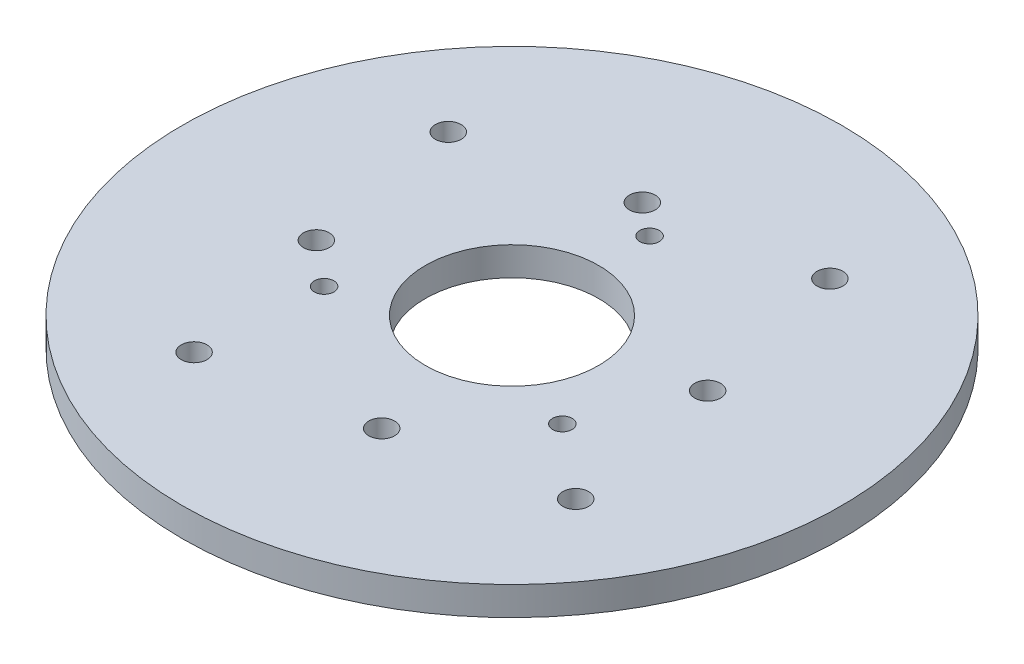
ISO-10303-21;
HEADER;
FILE_DESCRIPTION(('STEP AP214'),'2;1');
FILE_NAME('part.step','',(''),(''),'','','');
FILE_SCHEMA(('AUTOMOTIVE_DESIGN { 1 0 10303 214 1 1 1 1 }'));
ENDSEC;
DATA;
#1=APPLICATION_CONTEXT('core data for automotive mechanical design processes');
#2=APPLICATION_PROTOCOL_DEFINITION('international standard','automotive_design',2000,#1);
#3=PRODUCT_CONTEXT('',#1,'mechanical');
#4=PRODUCT('Part','Part','',(#3));
#5=PRODUCT_RELATED_PRODUCT_CATEGORY('part','',(#4));
#6=PRODUCT_DEFINITION_FORMATION('','',#4);
#7=PRODUCT_DEFINITION_CONTEXT('part definition',#1,'design');
#8=PRODUCT_DEFINITION('design','',#6,#7);
#9=PRODUCT_DEFINITION_SHAPE('','',#8);
#10=(LENGTH_UNIT() NAMED_UNIT(*) SI_UNIT(.MILLI.,.METRE.));
#11=(NAMED_UNIT(*) PLANE_ANGLE_UNIT() SI_UNIT($,.RADIAN.));
#12=(NAMED_UNIT(*) SI_UNIT($,.STERADIAN.) SOLID_ANGLE_UNIT());
#13=UNCERTAINTY_MEASURE_WITH_UNIT(LENGTH_MEASURE(1.E-05),#10,'distance_accuracy_value','');
#14=(GEOMETRIC_REPRESENTATION_CONTEXT(3) GLOBAL_UNCERTAINTY_ASSIGNED_CONTEXT((#13)) GLOBAL_UNIT_ASSIGNED_CONTEXT((#10,
#11,#12)) REPRESENTATION_CONTEXT('',''));
#15=CARTESIAN_POINT('',(0.,0.,0.));
#16=DIRECTION('',(0.,0.,1.));
#17=DIRECTION('',(1.,0.,0.));
#18=AXIS2_PLACEMENT_3D('',#15,#16,#17);
#19=CARTESIAN_POINT('',(0.,5.,0.));
#20=DIRECTION('',(0.,1.,0.));
#21=DIRECTION('',(0.,0.,1.));
#22=AXIS2_PLACEMENT_3D('',#19,#20,#21);
#23=PLANE('',#22);
#24=CARTESIAN_POINT('',(0.,5.,-24.));
#25=DIRECTION('',(0.,1.,0.));
#26=DIRECTION('',(0.,0.,1.));
#27=AXIS2_PLACEMENT_3D('',#24,#25,#26);
#28=CIRCLE('',#27,1.7);
#29=CARTESIAN_POINT('',(0.,5.,-22.3));
#30=VERTEX_POINT('',#29);
#31=EDGE_CURVE('E120',#30,#30,#28,.T.);
#32=ORIENTED_EDGE('',*,*,#31,.F.);
#33=EDGE_LOOP('',(#32));
#34=FACE_BOUND('',#33,.T.);
#35=CARTESIAN_POINT('',(20.7846096908265,5.,12.0000000000001));
#36=DIRECTION('',(0.,1.,0.));
#37=DIRECTION('',(0.,0.,1.));
#38=AXIS2_PLACEMENT_3D('',#35,#36,#37);
#39=CIRCLE('',#38,1.7);
#40=CARTESIAN_POINT('',(20.7846096908265,5.,13.7000000000001));
#41=VERTEX_POINT('',#40);
#42=EDGE_CURVE('E117',#41,#41,#39,.T.);
#43=ORIENTED_EDGE('',*,*,#42,.F.);
#44=EDGE_LOOP('',(#43));
#45=FACE_BOUND('',#44,.T.);
#46=CARTESIAN_POINT('',(-20.7846096908266,5.,11.9999999999998));
#47=DIRECTION('',(0.,1.,0.));
#48=DIRECTION('',(0.,0.,1.));
#49=AXIS2_PLACEMENT_3D('',#46,#47,#48);
#50=CIRCLE('',#49,1.7);
#51=CARTESIAN_POINT('',(-20.7846096908266,5.,13.6999999999998));
#52=VERTEX_POINT('',#51);
#53=EDGE_CURVE('E111',#52,#52,#50,.T.);
#54=ORIENTED_EDGE('',*,*,#53,.F.);
#55=EDGE_LOOP('',(#54));
#56=FACE_BOUND('',#55,.T.);
#57=CARTESIAN_POINT('',(28.4344418205609,5.,-5.69934367740181));
#58=DIRECTION('',(0.,1.,0.));
#59=DIRECTION('',(0.,0.,1.));
#60=AXIS2_PLACEMENT_3D('',#57,#58,#59);
#61=CIRCLE('',#60,2.25000000000002);
#62=CARTESIAN_POINT('',(28.4344418205609,5.,-3.44934367740179));
#63=VERTEX_POINT('',#62);
#64=EDGE_CURVE('E93',#63,#63,#61,.T.);
#65=ORIENTED_EDGE('',*,*,#64,.F.);
#66=EDGE_LOOP('',(#65));
#67=FACE_BOUND('',#66,.T.);
#68=CARTESIAN_POINT('',(-5.69934367740181,5.,-28.4344418205609));
#69=DIRECTION('',(0.,1.,0.));
#70=DIRECTION('',(0.,0.,1.));
#71=AXIS2_PLACEMENT_3D('',#68,#69,#70);
#72=CIRCLE('',#71,2.25000000000004);
#73=CARTESIAN_POINT('',(-5.69934367740181,5.,-26.1844418205608));
#74=VERTEX_POINT('',#73);
#75=EDGE_CURVE('E81',#74,#74,#72,.T.);
#76=ORIENTED_EDGE('',*,*,#75,.F.);
#77=EDGE_LOOP('',(#76));
#78=FACE_BOUND('',#77,.T.);
#79=CARTESIAN_POINT('',(-28.4344418205609,5.,5.69934367740181));
#80=DIRECTION('',(0.,1.,0.));
#81=DIRECTION('',(0.,0.,1.));
#82=AXIS2_PLACEMENT_3D('',#79,#80,#81);
#83=CIRCLE('',#82,2.25000000000002);
#84=CARTESIAN_POINT('',(-28.4344418205609,5.,7.94934367740183));
#85=VERTEX_POINT('',#84);
#86=EDGE_CURVE('E69',#85,#85,#83,.T.);
#87=ORIENTED_EDGE('',*,*,#86,.F.);
#88=EDGE_LOOP('',(#87));
#89=FACE_BOUND('',#88,.T.);
#90=CARTESIAN_POINT('',(5.69934367740181,5.,28.4344418205609));
#91=DIRECTION('',(0.,1.,0.));
#92=DIRECTION('',(0.,0.,1.));
#93=AXIS2_PLACEMENT_3D('',#90,#91,#92);
#94=CIRCLE('',#93,2.25000000000004);
#95=CARTESIAN_POINT('',(5.69934367740181,5.,30.6844418205609));
#96=VERTEX_POINT('',#95);
#97=EDGE_CURVE('E57',#96,#96,#94,.T.);
#98=ORIENTED_EDGE('',*,*,#97,.F.);
#99=EDGE_LOOP('',(#98));
#100=FACE_BOUND('',#99,.T.);
#101=CARTESIAN_POINT('',(0.,5.,0.));
#102=DIRECTION('',(0.,1.,0.));
#103=DIRECTION('',(0.,0.,1.));
#104=AXIS2_PLACEMENT_3D('',#101,#102,#103);
#105=CIRCLE('',#104,57.5);
#106=CARTESIAN_POINT('',(0.,5.,57.5));
#107=VERTEX_POINT('',#106);
#108=EDGE_CURVE('E10',#107,#107,#105,.T.);
#109=ORIENTED_EDGE('',*,*,#108,.T.);
#110=EDGE_LOOP('',(#109));
#111=FACE_BOUND('',#110,.T.);
#112=CARTESIAN_POINT('',(0.,5.,0.));
#113=DIRECTION('',(0.,1.,0.));
#114=DIRECTION('',(0.,0.,1.));
#115=AXIS2_PLACEMENT_3D('',#112,#113,#114);
#116=CIRCLE('',#115,15.125);
#117=CARTESIAN_POINT('',(0.,5.,15.125));
#118=VERTEX_POINT('',#117);
#119=EDGE_CURVE('E52',#118,#118,#116,.T.);
#120=ORIENTED_EDGE('',*,*,#119,.F.);
#121=EDGE_LOOP('',(#120));
#122=FACE_BOUND('',#121,.T.);
#123=CARTESIAN_POINT('',(33.2913533698986,5.,22.1739890592681));
#124=DIRECTION('',(0.,1.,0.));
#125=DIRECTION('',(0.,0.,1.));
#126=AXIS2_PLACEMENT_3D('',#123,#124,#125);
#127=CIRCLE('',#126,2.25000000000008);
#128=CARTESIAN_POINT('',(33.2913533698986,5.,24.4239890592682));
#129=VERTEX_POINT('',#128);
#130=EDGE_CURVE('E63',#129,#129,#127,.T.);
#131=ORIENTED_EDGE('',*,*,#130,.F.);
#132=EDGE_LOOP('',(#131));
#133=FACE_BOUND('',#132,.T.);
#134=CARTESIAN_POINT('',(-22.1739890592681,5.,33.2913533698986));
#135=DIRECTION('',(0.,1.,0.));
#136=DIRECTION('',(0.,0.,1.));
#137=AXIS2_PLACEMENT_3D('',#134,#135,#136);
#138=CIRCLE('',#137,2.25000000000004);
#139=CARTESIAN_POINT('',(-22.1739890592681,5.,35.5413533698986));
#140=VERTEX_POINT('',#139);
#141=EDGE_CURVE('E75',#140,#140,#138,.T.);
#142=ORIENTED_EDGE('',*,*,#141,.F.);
#143=EDGE_LOOP('',(#142));
#144=FACE_BOUND('',#143,.T.);
#145=CARTESIAN_POINT('',(-33.2913533698986,5.,-22.1739890592681));
#146=DIRECTION('',(0.,1.,0.));
#147=DIRECTION('',(0.,0.,1.));
#148=AXIS2_PLACEMENT_3D('',#145,#146,#147);
#149=CIRCLE('',#148,2.25000000000004);
#150=CARTESIAN_POINT('',(-33.2913533698986,5.,-19.9239890592681));
#151=VERTEX_POINT('',#150);
#152=EDGE_CURVE('E87',#151,#151,#149,.T.);
#153=ORIENTED_EDGE('',*,*,#152,.F.);
#154=EDGE_LOOP('',(#153));
#155=FACE_BOUND('',#154,.T.);
#156=CARTESIAN_POINT('',(22.1739890592681,5.,-33.2913533698986));
#157=DIRECTION('',(0.,1.,0.));
#158=DIRECTION('',(0.,0.,1.));
#159=AXIS2_PLACEMENT_3D('',#156,#157,#158);
#160=CIRCLE('',#159,2.25000000000002);
#161=CARTESIAN_POINT('',(22.1739890592681,5.,-31.0413533698985));
#162=VERTEX_POINT('',#161);
#163=EDGE_CURVE('E99',#162,#162,#160,.T.);
#164=ORIENTED_EDGE('',*,*,#163,.F.);
#165=EDGE_LOOP('',(#164));
#166=FACE_BOUND('',#165,.T.);
#167=ADVANCED_FACE('F41',(#34,#45,#56,#67,#78,#89,#100,#111,#122,#133,#144,#155,#166),#23,.T.);
#168=CARTESIAN_POINT('',(0.,0.,0.));
#169=DIRECTION('',(0.,1.,0.));
#170=DIRECTION('',(0.,0.,1.));
#171=AXIS2_PLACEMENT_3D('',#168,#169,#170);
#172=PLANE('',#171);
#173=CARTESIAN_POINT('',(0.,0.,-24.));
#174=DIRECTION('',(0.,1.,0.));
#175=DIRECTION('',(0.,0.,1.));
#176=AXIS2_PLACEMENT_3D('',#173,#174,#175);
#177=CIRCLE('',#176,1.7);
#178=CARTESIAN_POINT('',(0.,0.,-22.3));
#179=VERTEX_POINT('',#178);
#180=EDGE_CURVE('E105',#179,#179,#177,.T.);
#181=ORIENTED_EDGE('',*,*,#180,.T.);
#182=EDGE_LOOP('',(#181));
#183=FACE_BOUND('',#182,.T.);
#184=CARTESIAN_POINT('',(20.7846096908265,0.,12.0000000000001));
#185=DIRECTION('',(0.,1.,0.));
#186=DIRECTION('',(0.,0.,1.));
#187=AXIS2_PLACEMENT_3D('',#184,#185,#186);
#188=CIRCLE('',#187,1.7);
#189=CARTESIAN_POINT('',(20.7846096908265,0.,13.7000000000001));
#190=VERTEX_POINT('',#189);
#191=EDGE_CURVE('E114',#190,#190,#188,.T.);
#192=ORIENTED_EDGE('',*,*,#191,.T.);
#193=EDGE_LOOP('',(#192));
#194=FACE_BOUND('',#193,.T.);
#195=CARTESIAN_POINT('',(-20.7846096908266,0.,11.9999999999998));
#196=DIRECTION('',(0.,1.,0.));
#197=DIRECTION('',(0.,0.,1.));
#198=AXIS2_PLACEMENT_3D('',#195,#196,#197);
#199=CIRCLE('',#198,1.7);
#200=CARTESIAN_POINT('',(-20.7846096908266,0.,13.6999999999998));
#201=VERTEX_POINT('',#200);
#202=EDGE_CURVE('E108',#201,#201,#199,.T.);
#203=ORIENTED_EDGE('',*,*,#202,.T.);
#204=EDGE_LOOP('',(#203));
#205=FACE_BOUND('',#204,.T.);
#206=CARTESIAN_POINT('',(0.,0.,0.));
#207=DIRECTION('',(0.,1.,0.));
#208=DIRECTION('',(0.,0.,1.));
#209=AXIS2_PLACEMENT_3D('',#206,#207,#208);
#210=CIRCLE('',#209,57.5);
#211=CARTESIAN_POINT('',(0.,0.,57.5));
#212=VERTEX_POINT('',#211);
#213=EDGE_CURVE('E45',#212,#212,#210,.T.);
#214=ORIENTED_EDGE('',*,*,#213,.F.);
#215=EDGE_LOOP('',(#214));
#216=FACE_BOUND('',#215,.T.);
#217=CARTESIAN_POINT('',(0.,0.,0.));
#218=DIRECTION('',(0.,1.,0.));
#219=DIRECTION('',(0.,0.,1.));
#220=AXIS2_PLACEMENT_3D('',#217,#218,#219);
#221=CIRCLE('',#220,15.125);
#222=CARTESIAN_POINT('',(0.,0.,15.125));
#223=VERTEX_POINT('',#222);
#224=EDGE_CURVE('E54',#223,#223,#221,.T.);
#225=ORIENTED_EDGE('',*,*,#224,.T.);
#226=EDGE_LOOP('',(#225));
#227=FACE_BOUND('',#226,.T.);
#228=CARTESIAN_POINT('',(5.69934367740181,0.,28.4344418205609));
#229=DIRECTION('',(0.,1.,0.));
#230=DIRECTION('',(0.,0.,1.));
#231=AXIS2_PLACEMENT_3D('',#228,#229,#230);
#232=CIRCLE('',#231,2.25000000000004);
#233=CARTESIAN_POINT('',(5.69934367740181,0.,30.6844418205609));
#234=VERTEX_POINT('',#233);
#235=EDGE_CURVE('E60',#234,#234,#232,.T.);
#236=ORIENTED_EDGE('',*,*,#235,.T.);
#237=EDGE_LOOP('',(#236));
#238=FACE_BOUND('',#237,.T.);
#239=CARTESIAN_POINT('',(33.2913533698986,0.,22.1739890592681));
#240=DIRECTION('',(0.,1.,0.));
#241=DIRECTION('',(0.,0.,1.));
#242=AXIS2_PLACEMENT_3D('',#239,#240,#241);
#243=CIRCLE('',#242,2.25000000000008);
#244=CARTESIAN_POINT('',(33.2913533698986,0.,24.4239890592682));
#245=VERTEX_POINT('',#244);
#246=EDGE_CURVE('E66',#245,#245,#243,.T.);
#247=ORIENTED_EDGE('',*,*,#246,.T.);
#248=EDGE_LOOP('',(#247));
#249=FACE_BOUND('',#248,.T.);
#250=CARTESIAN_POINT('',(-28.4344418205609,0.,5.69934367740181));
#251=DIRECTION('',(0.,1.,0.));
#252=DIRECTION('',(0.,0.,1.));
#253=AXIS2_PLACEMENT_3D('',#250,#251,#252);
#254=CIRCLE('',#253,2.25000000000002);
#255=CARTESIAN_POINT('',(-28.4344418205609,0.,7.94934367740183));
#256=VERTEX_POINT('',#255);
#257=EDGE_CURVE('E72',#256,#256,#254,.T.);
#258=ORIENTED_EDGE('',*,*,#257,.T.);
#259=EDGE_LOOP('',(#258));
#260=FACE_BOUND('',#259,.T.);
#261=CARTESIAN_POINT('',(-22.1739890592681,0.,33.2913533698986));
#262=DIRECTION('',(0.,1.,0.));
#263=DIRECTION('',(0.,0.,1.));
#264=AXIS2_PLACEMENT_3D('',#261,#262,#263);
#265=CIRCLE('',#264,2.25000000000004);
#266=CARTESIAN_POINT('',(-22.1739890592681,0.,35.5413533698986));
#267=VERTEX_POINT('',#266);
#268=EDGE_CURVE('E78',#267,#267,#265,.T.);
#269=ORIENTED_EDGE('',*,*,#268,.T.);
#270=EDGE_LOOP('',(#269));
#271=FACE_BOUND('',#270,.T.);
#272=CARTESIAN_POINT('',(-5.69934367740181,0.,-28.4344418205609));
#273=DIRECTION('',(0.,1.,0.));
#274=DIRECTION('',(0.,0.,1.));
#275=AXIS2_PLACEMENT_3D('',#272,#273,#274);
#276=CIRCLE('',#275,2.25000000000004);
#277=CARTESIAN_POINT('',(-5.69934367740181,0.,-26.1844418205608));
#278=VERTEX_POINT('',#277);
#279=EDGE_CURVE('E84',#278,#278,#276,.T.);
#280=ORIENTED_EDGE('',*,*,#279,.T.);
#281=EDGE_LOOP('',(#280));
#282=FACE_BOUND('',#281,.T.);
#283=CARTESIAN_POINT('',(-33.2913533698986,0.,-22.1739890592681));
#284=DIRECTION('',(0.,1.,0.));
#285=DIRECTION('',(0.,0.,1.));
#286=AXIS2_PLACEMENT_3D('',#283,#284,#285);
#287=CIRCLE('',#286,2.25000000000004);
#288=CARTESIAN_POINT('',(-33.2913533698986,0.,-19.9239890592681));
#289=VERTEX_POINT('',#288);
#290=EDGE_CURVE('E90',#289,#289,#287,.T.);
#291=ORIENTED_EDGE('',*,*,#290,.T.);
#292=EDGE_LOOP('',(#291));
#293=FACE_BOUND('',#292,.T.);
#294=CARTESIAN_POINT('',(28.4344418205609,0.,-5.69934367740181));
#295=DIRECTION('',(0.,1.,0.));
#296=DIRECTION('',(0.,0.,1.));
#297=AXIS2_PLACEMENT_3D('',#294,#295,#296);
#298=CIRCLE('',#297,2.25000000000002);
#299=CARTESIAN_POINT('',(28.4344418205609,0.,-3.44934367740179));
#300=VERTEX_POINT('',#299);
#301=EDGE_CURVE('E96',#300,#300,#298,.T.);
#302=ORIENTED_EDGE('',*,*,#301,.T.);
#303=EDGE_LOOP('',(#302));
#304=FACE_BOUND('',#303,.T.);
#305=CARTESIAN_POINT('',(22.1739890592681,0.,-33.2913533698986));
#306=DIRECTION('',(0.,1.,0.));
#307=DIRECTION('',(0.,0.,1.));
#308=AXIS2_PLACEMENT_3D('',#305,#306,#307);
#309=CIRCLE('',#308,2.25000000000002);
#310=CARTESIAN_POINT('',(22.1739890592681,0.,-31.0413533698985));
#311=VERTEX_POINT('',#310);
#312=EDGE_CURVE('E102',#311,#311,#309,.T.);
#313=ORIENTED_EDGE('',*,*,#312,.T.);
#314=EDGE_LOOP('',(#313));
#315=FACE_BOUND('',#314,.T.);
#316=ADVANCED_FACE('F126',(#183,#194,#205,#216,#227,#238,#249,#260,#271,#282,#293,#304,#315),
#172,.F.);
#317=CARTESIAN_POINT('',(0.,5.,0.));
#318=DIRECTION('',(0.,-1.,0.));
#319=DIRECTION('',(0.,0.,-1.));
#320=AXIS2_PLACEMENT_3D('',#317,#318,#319);
#321=CYLINDRICAL_SURFACE('',#320,57.5);
#322=ORIENTED_EDGE('',*,*,#108,.F.);
#323=EDGE_LOOP('',(#322));
#324=FACE_BOUND('',#323,.T.);
#325=ORIENTED_EDGE('',*,*,#213,.T.);
#326=EDGE_LOOP('',(#325));
#327=FACE_BOUND('',#326,.T.);
#328=ADVANCED_FACE('F43',(#324,#327),#321,.T.);
#329=CARTESIAN_POINT('',(0.,5.,0.));
#330=DIRECTION('',(0.,-1.,0.));
#331=DIRECTION('',(0.,0.,-1.));
#332=AXIS2_PLACEMENT_3D('',#329,#330,#331);
#333=CYLINDRICAL_SURFACE('',#332,15.125);
#334=ORIENTED_EDGE('',*,*,#119,.T.);
#335=EDGE_LOOP('',(#334));
#336=FACE_BOUND('',#335,.T.);
#337=ORIENTED_EDGE('',*,*,#224,.F.);
#338=EDGE_LOOP('',(#337));
#339=FACE_BOUND('',#338,.T.);
#340=ADVANCED_FACE('F174',(#336,#339),#333,.F.);
#341=CARTESIAN_POINT('',(5.69934367740181,5.,28.4344418205609));
#342=DIRECTION('',(0.,-1.,0.));
#343=DIRECTION('',(0.,0.,-1.));
#344=AXIS2_PLACEMENT_3D('',#341,#342,#343);
#345=CYLINDRICAL_SURFACE('',#344,2.25000000000004);
#346=ORIENTED_EDGE('',*,*,#97,.T.);
#347=EDGE_LOOP('',(#346));
#348=FACE_BOUND('',#347,.T.);
#349=ORIENTED_EDGE('',*,*,#235,.F.);
#350=EDGE_LOOP('',(#349));
#351=FACE_BOUND('',#350,.T.);
#352=ADVANCED_FACE('F179',(#348,#351),#345,.F.);
#353=CARTESIAN_POINT('',(33.2913533698986,5.,22.1739890592681));
#354=DIRECTION('',(0.,-1.,0.));
#355=DIRECTION('',(0.,0.,-1.));
#356=AXIS2_PLACEMENT_3D('',#353,#354,#355);
#357=CYLINDRICAL_SURFACE('',#356,2.25000000000008);
#358=ORIENTED_EDGE('',*,*,#130,.T.);
#359=EDGE_LOOP('',(#358));
#360=FACE_BOUND('',#359,.T.);
#361=ORIENTED_EDGE('',*,*,#246,.F.);
#362=EDGE_LOOP('',(#361));
#363=FACE_BOUND('',#362,.T.);
#364=ADVANCED_FACE('F183',(#360,#363),#357,.F.);
#365=CARTESIAN_POINT('',(-28.4344418205609,5.,5.69934367740181));
#366=DIRECTION('',(0.,-1.,0.));
#367=DIRECTION('',(0.,0.,-1.));
#368=AXIS2_PLACEMENT_3D('',#365,#366,#367);
#369=CYLINDRICAL_SURFACE('',#368,2.25000000000002);
#370=ORIENTED_EDGE('',*,*,#86,.T.);
#371=EDGE_LOOP('',(#370));
#372=FACE_BOUND('',#371,.T.);
#373=ORIENTED_EDGE('',*,*,#257,.F.);
#374=EDGE_LOOP('',(#373));
#375=FACE_BOUND('',#374,.T.);
#376=ADVANCED_FACE('F187',(#372,#375),#369,.F.);
#377=CARTESIAN_POINT('',(-22.1739890592681,5.,33.2913533698986));
#378=DIRECTION('',(0.,-1.,0.));
#379=DIRECTION('',(0.,0.,-1.));
#380=AXIS2_PLACEMENT_3D('',#377,#378,#379);
#381=CYLINDRICAL_SURFACE('',#380,2.25000000000004);
#382=ORIENTED_EDGE('',*,*,#141,.T.);
#383=EDGE_LOOP('',(#382));
#384=FACE_BOUND('',#383,.T.);
#385=ORIENTED_EDGE('',*,*,#268,.F.);
#386=EDGE_LOOP('',(#385));
#387=FACE_BOUND('',#386,.T.);
#388=ADVANCED_FACE('F191',(#384,#387),#381,.F.);
#389=CARTESIAN_POINT('',(-5.69934367740181,5.,-28.4344418205609));
#390=DIRECTION('',(0.,-1.,0.));
#391=DIRECTION('',(0.,0.,-1.));
#392=AXIS2_PLACEMENT_3D('',#389,#390,#391);
#393=CYLINDRICAL_SURFACE('',#392,2.25000000000004);
#394=ORIENTED_EDGE('',*,*,#75,.T.);
#395=EDGE_LOOP('',(#394));
#396=FACE_BOUND('',#395,.T.);
#397=ORIENTED_EDGE('',*,*,#279,.F.);
#398=EDGE_LOOP('',(#397));
#399=FACE_BOUND('',#398,.T.);
#400=ADVANCED_FACE('F195',(#396,#399),#393,.F.);
#401=CARTESIAN_POINT('',(-33.2913533698986,5.,-22.1739890592681));
#402=DIRECTION('',(0.,-1.,0.));
#403=DIRECTION('',(0.,0.,-1.));
#404=AXIS2_PLACEMENT_3D('',#401,#402,#403);
#405=CYLINDRICAL_SURFACE('',#404,2.25000000000004);
#406=ORIENTED_EDGE('',*,*,#152,.T.);
#407=EDGE_LOOP('',(#406));
#408=FACE_BOUND('',#407,.T.);
#409=ORIENTED_EDGE('',*,*,#290,.F.);
#410=EDGE_LOOP('',(#409));
#411=FACE_BOUND('',#410,.T.);
#412=ADVANCED_FACE('F199',(#408,#411),#405,.F.);
#413=CARTESIAN_POINT('',(28.4344418205609,5.,-5.69934367740181));
#414=DIRECTION('',(0.,-1.,0.));
#415=DIRECTION('',(0.,0.,-1.));
#416=AXIS2_PLACEMENT_3D('',#413,#414,#415);
#417=CYLINDRICAL_SURFACE('',#416,2.25000000000002);
#418=ORIENTED_EDGE('',*,*,#64,.T.);
#419=EDGE_LOOP('',(#418));
#420=FACE_BOUND('',#419,.T.);
#421=ORIENTED_EDGE('',*,*,#301,.F.);
#422=EDGE_LOOP('',(#421));
#423=FACE_BOUND('',#422,.T.);
#424=ADVANCED_FACE('F165',(#420,#423),#417,.F.);
#425=CARTESIAN_POINT('',(22.1739890592681,5.,-33.2913533698986));
#426=DIRECTION('',(0.,-1.,0.));
#427=DIRECTION('',(0.,0.,-1.));
#428=AXIS2_PLACEMENT_3D('',#425,#426,#427);
#429=CYLINDRICAL_SURFACE('',#428,2.25000000000002);
#430=ORIENTED_EDGE('',*,*,#163,.T.);
#431=EDGE_LOOP('',(#430));
#432=FACE_BOUND('',#431,.T.);
#433=ORIENTED_EDGE('',*,*,#312,.F.);
#434=EDGE_LOOP('',(#433));
#435=FACE_BOUND('',#434,.T.);
#436=ADVANCED_FACE('F161',(#432,#435),#429,.F.);
#437=CARTESIAN_POINT('',(-20.7846096908266,0.,11.9999999999998));
#438=DIRECTION('',(0.,1.,0.));
#439=DIRECTION('',(0.,0.,1.));
#440=AXIS2_PLACEMENT_3D('',#437,#438,#439);
#441=CYLINDRICAL_SURFACE('',#440,1.7);
#442=ORIENTED_EDGE('',*,*,#202,.F.);
#443=EDGE_LOOP('',(#442));
#444=FACE_BOUND('',#443,.T.);
#445=ORIENTED_EDGE('',*,*,#53,.T.);
#446=EDGE_LOOP('',(#445));
#447=FACE_BOUND('',#446,.T.);
#448=ADVANCED_FACE('F164',(#444,#447),#441,.F.);
#449=CARTESIAN_POINT('',(20.7846096908265,0.,12.0000000000001));
#450=DIRECTION('',(0.,1.,0.));
#451=DIRECTION('',(0.,0.,1.));
#452=AXIS2_PLACEMENT_3D('',#449,#450,#451);
#453=CYLINDRICAL_SURFACE('',#452,1.7);
#454=ORIENTED_EDGE('',*,*,#191,.F.);
#455=EDGE_LOOP('',(#454));
#456=FACE_BOUND('',#455,.T.);
#457=ORIENTED_EDGE('',*,*,#42,.T.);
#458=EDGE_LOOP('',(#457));
#459=FACE_BOUND('',#458,.T.);
#460=ADVANCED_FACE('F132',(#456,#459),#453,.F.);
#461=CARTESIAN_POINT('',(0.,0.,-24.));
#462=DIRECTION('',(0.,1.,0.));
#463=DIRECTION('',(0.,0.,1.));
#464=AXIS2_PLACEMENT_3D('',#461,#462,#463);
#465=CYLINDRICAL_SURFACE('',#464,1.7);
#466=ORIENTED_EDGE('',*,*,#180,.F.);
#467=EDGE_LOOP('',(#466));
#468=FACE_BOUND('',#467,.T.);
#469=ORIENTED_EDGE('',*,*,#31,.T.);
#470=EDGE_LOOP('',(#469));
#471=FACE_BOUND('',#470,.T.);
#472=ADVANCED_FACE('F129',(#468,#471),#465,.F.);
#473=CLOSED_SHELL('',(#167,#316,#328,#340,#352,#364,#376,#388,#400,#412,#424,#436,#448,#460,#472));
#474=MANIFOLD_SOLID_BREP('B2',#473);
#475=ADVANCED_BREP_SHAPE_REPRESENTATION('',(#18,#474),#14);
#476=SHAPE_DEFINITION_REPRESENTATION(#9,#475);
ENDSEC;
END-ISO-10303-21;
